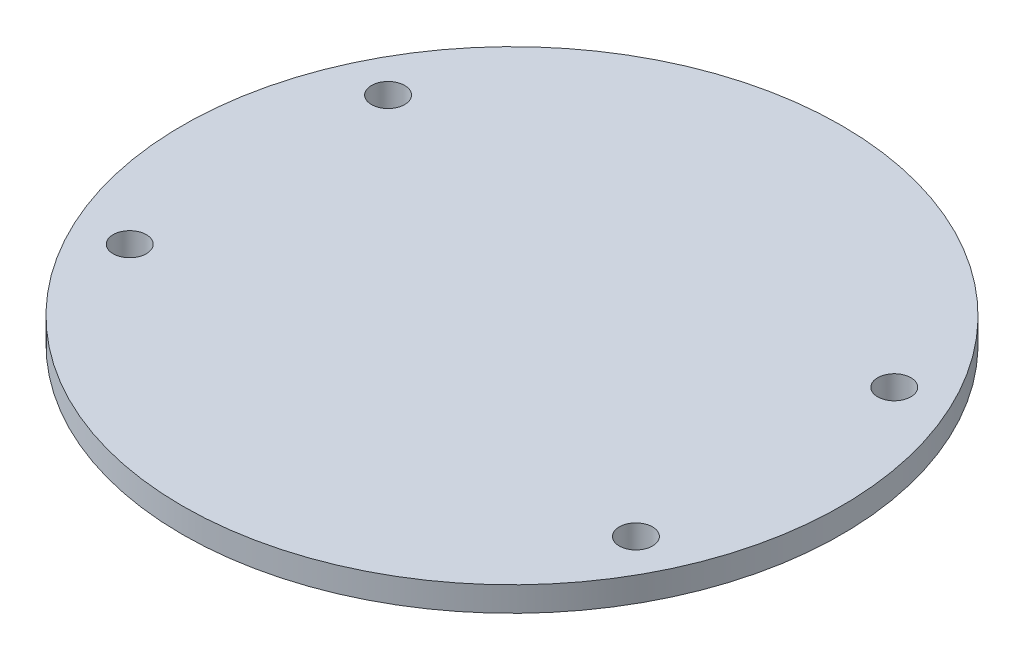
ISO-10303-21;
HEADER;
FILE_DESCRIPTION(('STEP AP214'),'2;1');
FILE_NAME('part.step','',(''),(''),'','','');
FILE_SCHEMA(('AUTOMOTIVE_DESIGN { 1 0 10303 214 1 1 1 1 }'));
ENDSEC;
DATA;
#1=APPLICATION_CONTEXT('core data for automotive mechanical design processes');
#2=APPLICATION_PROTOCOL_DEFINITION('international standard','automotive_design',2000,#1);
#3=PRODUCT_CONTEXT('',#1,'mechanical');
#4=PRODUCT('Part','Part','',(#3));
#5=PRODUCT_RELATED_PRODUCT_CATEGORY('part','',(#4));
#6=PRODUCT_DEFINITION_FORMATION('','',#4);
#7=PRODUCT_DEFINITION_CONTEXT('part definition',#1,'design');
#8=PRODUCT_DEFINITION('design','',#6,#7);
#9=PRODUCT_DEFINITION_SHAPE('','',#8);
#10=(LENGTH_UNIT() NAMED_UNIT(*) SI_UNIT(.MILLI.,.METRE.));
#11=(NAMED_UNIT(*) PLANE_ANGLE_UNIT() SI_UNIT($,.RADIAN.));
#12=(NAMED_UNIT(*) SI_UNIT($,.STERADIAN.) SOLID_ANGLE_UNIT());
#13=UNCERTAINTY_MEASURE_WITH_UNIT(LENGTH_MEASURE(1.E-05),#10,'distance_accuracy_value','');
#14=(GEOMETRIC_REPRESENTATION_CONTEXT(3) GLOBAL_UNCERTAINTY_ASSIGNED_CONTEXT((#13)) GLOBAL_UNIT_ASSIGNED_CONTEXT((#10,
#11,#12)) REPRESENTATION_CONTEXT('',''));
#15=CARTESIAN_POINT('',(0.,0.,0.));
#16=DIRECTION('',(0.,0.,1.));
#17=DIRECTION('',(1.,0.,0.));
#18=AXIS2_PLACEMENT_3D('',#15,#16,#17);
#19=CARTESIAN_POINT('',(-24.384,2.38125,12.446));
#20=DIRECTION('',(0.,-1.,0.));
#21=DIRECTION('',(0.,0.,-1.));
#22=AXIS2_PLACEMENT_3D('',#19,#20,#21);
#23=CYLINDRICAL_SURFACE('',#22,1.6);
#24=CARTESIAN_POINT('',(-24.384,2.38125,12.446));
#25=DIRECTION('',(0.,1.,0.));
#26=DIRECTION('',(0.,0.,1.));
#27=AXIS2_PLACEMENT_3D('',#24,#25,#26);
#28=CIRCLE('',#27,1.6);
#29=CARTESIAN_POINT('',(-24.384,2.38125,10.846));
#30=VERTEX_POINT('',#29);
#31=EDGE_CURVE('E43',#30,#30,#28,.T.);
#32=CARTESIAN_POINT('',(-24.384,0.,12.446));
#33=DIRECTION('',(0.,1.,0.));
#34=DIRECTION('',(0.,0.,1.));
#35=AXIS2_PLACEMENT_3D('',#32,#33,#34);
#36=CIRCLE('',#35,1.6);
#37=CARTESIAN_POINT('',(-24.384,0.,10.846));
#38=VERTEX_POINT('',#37);
#39=EDGE_CURVE('E62',#38,#38,#36,.T.);
#40=CARTESIAN_POINT('',(-24.384,2.38125,10.846));
#41=CARTESIAN_POINT('',(-24.384,2.3564453125,10.846));
#42=CARTESIAN_POINT('',(-24.384,2.331640625,10.846));
#43=CARTESIAN_POINT('',(-24.384,2.28203125,10.846));
#44=CARTESIAN_POINT('',(-24.384,2.2572265625,10.846));
#45=CARTESIAN_POINT('',(-24.384,2.2076171875,10.846));
#46=CARTESIAN_POINT('',(-24.384,2.1828125,10.846));
#47=CARTESIAN_POINT('',(-24.384,2.133203125,10.846));
#48=CARTESIAN_POINT('',(-24.384,2.1083984375,10.846));
#49=CARTESIAN_POINT('',(-24.384,2.0587890625,10.846));
#50=CARTESIAN_POINT('',(-24.384,2.033984375,10.846));
#51=CARTESIAN_POINT('',(-24.384,1.984375,10.846));
#52=CARTESIAN_POINT('',(-24.384,1.9595703125,10.846));
#53=CARTESIAN_POINT('',(-24.384,1.9099609375,10.846));
#54=CARTESIAN_POINT('',(-24.384,1.88515625,10.846));
#55=CARTESIAN_POINT('',(-24.384,1.835546875,10.846));
#56=CARTESIAN_POINT('',(-24.384,1.8107421875,10.846));
#57=CARTESIAN_POINT('',(-24.384,1.7611328125,10.846));
#58=CARTESIAN_POINT('',(-24.384,1.736328125,10.846));
#59=CARTESIAN_POINT('',(-24.384,1.68671875,10.846));
#60=CARTESIAN_POINT('',(-24.384,1.6619140625,10.846));
#61=CARTESIAN_POINT('',(-24.384,1.6123046875,10.846));
#62=CARTESIAN_POINT('',(-24.384,1.5875,10.846));
#63=CARTESIAN_POINT('',(-24.384,1.537890625,10.846));
#64=CARTESIAN_POINT('',(-24.384,1.5130859375,10.846));
#65=CARTESIAN_POINT('',(-24.384,1.4634765625,10.846));
#66=CARTESIAN_POINT('',(-24.384,1.438671875,10.846));
#67=CARTESIAN_POINT('',(-24.384,1.3890625,10.846));
#68=CARTESIAN_POINT('',(-24.384,1.3642578125,10.846));
#69=CARTESIAN_POINT('',(-24.384,1.3146484375,10.846));
#70=CARTESIAN_POINT('',(-24.384,1.28984375,10.846));
#71=CARTESIAN_POINT('',(-24.384,1.240234375,10.846));
#72=CARTESIAN_POINT('',(-24.384,1.2154296875,10.846));
#73=CARTESIAN_POINT('',(-24.384,1.1658203125,10.846));
#74=CARTESIAN_POINT('',(-24.384,1.141015625,10.846));
#75=CARTESIAN_POINT('',(-24.384,1.09140625,10.846));
#76=CARTESIAN_POINT('',(-24.384,1.0666015625,10.846));
#77=CARTESIAN_POINT('',(-24.384,1.0169921875,10.846));
#78=CARTESIAN_POINT('',(-24.384,0.9921875,10.846));
#79=CARTESIAN_POINT('',(-24.384,0.942578125,10.846));
#80=CARTESIAN_POINT('',(-24.384,0.9177734375,10.846));
#81=CARTESIAN_POINT('',(-24.384,0.8681640625,10.846));
#82=CARTESIAN_POINT('',(-24.384,0.843359375,10.846));
#83=CARTESIAN_POINT('',(-24.384,0.79375,10.846));
#84=CARTESIAN_POINT('',(-24.384,0.7689453125,10.846));
#85=CARTESIAN_POINT('',(-24.384,0.7193359375,10.846));
#86=CARTESIAN_POINT('',(-24.384,0.69453125,10.846));
#87=CARTESIAN_POINT('',(-24.384,0.644921875,10.846));
#88=CARTESIAN_POINT('',(-24.384,0.6201171875,10.846));
#89=CARTESIAN_POINT('',(-24.384,0.5705078125,10.846));
#90=CARTESIAN_POINT('',(-24.384,0.545703125,10.846));
#91=CARTESIAN_POINT('',(-24.384,0.49609375,10.846));
#92=CARTESIAN_POINT('',(-24.384,0.4712890625,10.846));
#93=CARTESIAN_POINT('',(-24.384,0.4216796875,10.846));
#94=CARTESIAN_POINT('',(-24.384,0.396875,10.846));
#95=CARTESIAN_POINT('',(-24.384,0.347265625,10.846));
#96=CARTESIAN_POINT('',(-24.384,0.3224609375,10.846));
#97=CARTESIAN_POINT('',(-24.384,0.2728515625,10.846));
#98=CARTESIAN_POINT('',(-24.384,0.248046875,10.846));
#99=CARTESIAN_POINT('',(-24.384,0.1984375,10.846));
#100=CARTESIAN_POINT('',(-24.384,0.1736328125,10.846));
#101=CARTESIAN_POINT('',(-24.384,0.1240234375,10.846));
#102=CARTESIAN_POINT('',(-24.384,0.0992187500000001,10.846));
#103=CARTESIAN_POINT('',(-24.384,0.049609375,10.846));
#104=CARTESIAN_POINT('',(-24.384,0.0248046875,10.846));
#105=CARTESIAN_POINT('',(-24.384,0.,10.846));
#106=B_SPLINE_CURVE_WITH_KNOTS('',3,(#40,#41,#42,#43,#44,#45,#46,#47,#48,#49,#50,#51,#52,#53,
#54,#55,#56,#57,#58,#59,#60,#61,#62,#63,#64,#65,#66,#67,#68,#69,#70,#71,#72,#73,#74,#75,#76,#77,
#78,#79,#80,#81,#82,#83,#84,#85,#86,#87,#88,#89,#90,#91,#92,#93,#94,#95,#96,#97,#98,#99,#100,
#101,#102,#103,#104,#105),.UNSPECIFIED.,.F.,.F.,(4,2,2,2,2,2,2,2,2,2,2,2,2,2,2,2,2,2,2,2,2,2,2,
2,2,2,2,2,2,2,2,2,4),(0.,0.0744140624999996,0.148828125,0.2232421875,0.29765625,0.3720703125,
0.446484375,0.5208984375,0.5953125,0.6697265625,0.744140625,0.8185546875,0.89296875,
0.9673828125,1.041796875,1.1162109375,1.190625,1.2650390625,1.339453125,1.4138671875,1.48828125,
1.5626953125,1.637109375,1.7115234375,1.7859375,1.8603515625,1.934765625,2.0091796875,
2.08359375,2.1580078125,2.232421875,2.3068359375,2.38125),.UNSPECIFIED.);
#107=EDGE_CURVE('BSEAM34',#30,#38,#106,.T.);
#108=ORIENTED_EDGE('',*,*,#31,.T.);
#109=ORIENTED_EDGE('',*,*,#39,.F.);
#110=ORIENTED_EDGE('',*,*,#107,.T.);
#111=ORIENTED_EDGE('',*,*,#107,.F.);
#112=EDGE_LOOP('',(#108,#110,#109,#111));
#113=FACE_BOUND('',#112,.T.);
#114=ADVANCED_FACE('F34',(#113),#23,.F.);
#115=CARTESIAN_POINT('',(-24.384,2.38125,-12.446));
#116=DIRECTION('',(0.,-1.,0.));
#117=DIRECTION('',(0.,0.,-1.));
#118=AXIS2_PLACEMENT_3D('',#115,#116,#117);
#119=CYLINDRICAL_SURFACE('',#118,1.6);
#120=CARTESIAN_POINT('',(-24.384,2.38125,-12.446));
#121=DIRECTION('',(0.,1.,0.));
#122=DIRECTION('',(0.,0.,1.));
#123=AXIS2_PLACEMENT_3D('',#120,#121,#122);
#124=CIRCLE('',#123,1.6);
#125=CARTESIAN_POINT('',(-24.384,2.38125,-14.046));
#126=VERTEX_POINT('',#125);
#127=EDGE_CURVE('E48',#126,#126,#124,.T.);
#128=CARTESIAN_POINT('',(-24.384,0.,-12.446));
#129=DIRECTION('',(0.,1.,0.));
#130=DIRECTION('',(0.,0.,1.));
#131=AXIS2_PLACEMENT_3D('',#128,#129,#130);
#132=CIRCLE('',#131,1.6);
#133=CARTESIAN_POINT('',(-24.384,0.,-14.046));
#134=VERTEX_POINT('',#133);
#135=EDGE_CURVE('E60',#134,#134,#132,.T.);
#136=CARTESIAN_POINT('',(-24.384,2.38125,-14.046));
#137=CARTESIAN_POINT('',(-24.384,2.3564453125,-14.046));
#138=CARTESIAN_POINT('',(-24.384,2.331640625,-14.046));
#139=CARTESIAN_POINT('',(-24.384,2.28203125,-14.046));
#140=CARTESIAN_POINT('',(-24.384,2.2572265625,-14.046));
#141=CARTESIAN_POINT('',(-24.384,2.2076171875,-14.046));
#142=CARTESIAN_POINT('',(-24.384,2.1828125,-14.046));
#143=CARTESIAN_POINT('',(-24.384,2.133203125,-14.046));
#144=CARTESIAN_POINT('',(-24.384,2.1083984375,-14.046));
#145=CARTESIAN_POINT('',(-24.384,2.0587890625,-14.046));
#146=CARTESIAN_POINT('',(-24.384,2.033984375,-14.046));
#147=CARTESIAN_POINT('',(-24.384,1.984375,-14.046));
#148=CARTESIAN_POINT('',(-24.384,1.9595703125,-14.046));
#149=CARTESIAN_POINT('',(-24.384,1.9099609375,-14.046));
#150=CARTESIAN_POINT('',(-24.384,1.88515625,-14.046));
#151=CARTESIAN_POINT('',(-24.384,1.835546875,-14.046));
#152=CARTESIAN_POINT('',(-24.384,1.8107421875,-14.046));
#153=CARTESIAN_POINT('',(-24.384,1.7611328125,-14.046));
#154=CARTESIAN_POINT('',(-24.384,1.736328125,-14.046));
#155=CARTESIAN_POINT('',(-24.384,1.68671875,-14.046));
#156=CARTESIAN_POINT('',(-24.384,1.6619140625,-14.046));
#157=CARTESIAN_POINT('',(-24.384,1.6123046875,-14.046));
#158=CARTESIAN_POINT('',(-24.384,1.5875,-14.046));
#159=CARTESIAN_POINT('',(-24.384,1.537890625,-14.046));
#160=CARTESIAN_POINT('',(-24.384,1.5130859375,-14.046));
#161=CARTESIAN_POINT('',(-24.384,1.4634765625,-14.046));
#162=CARTESIAN_POINT('',(-24.384,1.438671875,-14.046));
#163=CARTESIAN_POINT('',(-24.384,1.3890625,-14.046));
#164=CARTESIAN_POINT('',(-24.384,1.3642578125,-14.046));
#165=CARTESIAN_POINT('',(-24.384,1.3146484375,-14.046));
#166=CARTESIAN_POINT('',(-24.384,1.28984375,-14.046));
#167=CARTESIAN_POINT('',(-24.384,1.240234375,-14.046));
#168=CARTESIAN_POINT('',(-24.384,1.2154296875,-14.046));
#169=CARTESIAN_POINT('',(-24.384,1.1658203125,-14.046));
#170=CARTESIAN_POINT('',(-24.384,1.141015625,-14.046));
#171=CARTESIAN_POINT('',(-24.384,1.09140625,-14.046));
#172=CARTESIAN_POINT('',(-24.384,1.0666015625,-14.046));
#173=CARTESIAN_POINT('',(-24.384,1.0169921875,-14.046));
#174=CARTESIAN_POINT('',(-24.384,0.9921875,-14.046));
#175=CARTESIAN_POINT('',(-24.384,0.942578125,-14.046));
#176=CARTESIAN_POINT('',(-24.384,0.9177734375,-14.046));
#177=CARTESIAN_POINT('',(-24.384,0.8681640625,-14.046));
#178=CARTESIAN_POINT('',(-24.384,0.843359375,-14.046));
#179=CARTESIAN_POINT('',(-24.384,0.79375,-14.046));
#180=CARTESIAN_POINT('',(-24.384,0.7689453125,-14.046));
#181=CARTESIAN_POINT('',(-24.384,0.7193359375,-14.046));
#182=CARTESIAN_POINT('',(-24.384,0.69453125,-14.046));
#183=CARTESIAN_POINT('',(-24.384,0.644921875,-14.046));
#184=CARTESIAN_POINT('',(-24.384,0.6201171875,-14.046));
#185=CARTESIAN_POINT('',(-24.384,0.5705078125,-14.046));
#186=CARTESIAN_POINT('',(-24.384,0.545703125,-14.046));
#187=CARTESIAN_POINT('',(-24.384,0.49609375,-14.046));
#188=CARTESIAN_POINT('',(-24.384,0.4712890625,-14.046));
#189=CARTESIAN_POINT('',(-24.384,0.4216796875,-14.046));
#190=CARTESIAN_POINT('',(-24.384,0.396875,-14.046));
#191=CARTESIAN_POINT('',(-24.384,0.347265625,-14.046));
#192=CARTESIAN_POINT('',(-24.384,0.3224609375,-14.046));
#193=CARTESIAN_POINT('',(-24.384,0.2728515625,-14.046));
#194=CARTESIAN_POINT('',(-24.384,0.248046875,-14.046));
#195=CARTESIAN_POINT('',(-24.384,0.1984375,-14.046));
#196=CARTESIAN_POINT('',(-24.384,0.1736328125,-14.046));
#197=CARTESIAN_POINT('',(-24.384,0.1240234375,-14.046));
#198=CARTESIAN_POINT('',(-24.384,0.0992187500000001,-14.046));
#199=CARTESIAN_POINT('',(-24.384,0.049609375,-14.046));
#200=CARTESIAN_POINT('',(-24.384,0.0248046875,-14.046));
#201=CARTESIAN_POINT('',(-24.384,0.,-14.046));
#202=B_SPLINE_CURVE_WITH_KNOTS('',3,(#136,#137,#138,#139,#140,#141,#142,#143,#144,#145,#146,
#147,#148,#149,#150,#151,#152,#153,#154,#155,#156,#157,#158,#159,#160,#161,#162,#163,#164,#165,
#166,#167,#168,#169,#170,#171,#172,#173,#174,#175,#176,#177,#178,#179,#180,#181,#182,#183,#184,
#185,#186,#187,#188,#189,#190,#191,#192,#193,#194,#195,#196,#197,#198,#199,#200,#201),
.UNSPECIFIED.,.F.,.F.,(4,2,2,2,2,2,2,2,2,2,2,2,2,2,2,2,2,2,2,2,2,2,2,2,2,2,2,2,2,2,2,2,4),(0.,
0.0744140624999996,0.148828125,0.2232421875,0.29765625,0.3720703125,0.446484375,0.5208984375,
0.5953125,0.6697265625,0.744140625,0.8185546875,0.89296875,0.9673828125,1.041796875,
1.1162109375,1.190625,1.2650390625,1.339453125,1.4138671875,1.48828125,1.5626953125,1.637109375,
1.7115234375,1.7859375,1.8603515625,1.934765625,2.0091796875,2.08359375,2.1580078125,
2.232421875,2.3068359375,2.38125),.UNSPECIFIED.);
#203=EDGE_CURVE('BSEAM89',#126,#134,#202,.T.);
#204=ORIENTED_EDGE('',*,*,#127,.T.);
#205=ORIENTED_EDGE('',*,*,#135,.F.);
#206=ORIENTED_EDGE('',*,*,#203,.T.);
#207=ORIENTED_EDGE('',*,*,#203,.F.);
#208=EDGE_LOOP('',(#204,#206,#205,#207));
#209=FACE_BOUND('',#208,.T.);
#210=ADVANCED_FACE('F89',(#209),#119,.F.);
#211=CARTESIAN_POINT('',(24.384,2.38125,12.446));
#212=DIRECTION('',(0.,-1.,0.));
#213=DIRECTION('',(0.,0.,-1.));
#214=AXIS2_PLACEMENT_3D('',#211,#212,#213);
#215=CYLINDRICAL_SURFACE('',#214,1.6);
#216=CARTESIAN_POINT('',(24.384,2.38125,12.446));
#217=DIRECTION('',(0.,1.,0.));
#218=DIRECTION('',(0.,0.,1.));
#219=AXIS2_PLACEMENT_3D('',#216,#217,#218);
#220=CIRCLE('',#219,1.6);
#221=CARTESIAN_POINT('',(24.384,2.38125,10.846));
#222=VERTEX_POINT('',#221);
#223=EDGE_CURVE('E72',#222,#222,#220,.T.);
#224=CARTESIAN_POINT('',(24.384,0.,12.446));
#225=DIRECTION('',(0.,1.,0.));
#226=DIRECTION('',(0.,0.,1.));
#227=AXIS2_PLACEMENT_3D('',#224,#225,#226);
#228=CIRCLE('',#227,1.6);
#229=CARTESIAN_POINT('',(24.384,0.,10.846));
#230=VERTEX_POINT('',#229);
#231=EDGE_CURVE('E57',#230,#230,#228,.T.);
#232=CARTESIAN_POINT('',(24.384,2.38125,10.846));
#233=CARTESIAN_POINT('',(24.384,2.3564453125,10.846));
#234=CARTESIAN_POINT('',(24.384,2.331640625,10.846));
#235=CARTESIAN_POINT('',(24.384,2.28203125,10.846));
#236=CARTESIAN_POINT('',(24.384,2.2572265625,10.846));
#237=CARTESIAN_POINT('',(24.384,2.2076171875,10.846));
#238=CARTESIAN_POINT('',(24.384,2.1828125,10.846));
#239=CARTESIAN_POINT('',(24.384,2.133203125,10.846));
#240=CARTESIAN_POINT('',(24.384,2.1083984375,10.846));
#241=CARTESIAN_POINT('',(24.384,2.0587890625,10.846));
#242=CARTESIAN_POINT('',(24.384,2.033984375,10.846));
#243=CARTESIAN_POINT('',(24.384,1.984375,10.846));
#244=CARTESIAN_POINT('',(24.384,1.9595703125,10.846));
#245=CARTESIAN_POINT('',(24.384,1.9099609375,10.846));
#246=CARTESIAN_POINT('',(24.384,1.88515625,10.846));
#247=CARTESIAN_POINT('',(24.384,1.835546875,10.846));
#248=CARTESIAN_POINT('',(24.384,1.8107421875,10.846));
#249=CARTESIAN_POINT('',(24.384,1.7611328125,10.846));
#250=CARTESIAN_POINT('',(24.384,1.736328125,10.846));
#251=CARTESIAN_POINT('',(24.384,1.68671875,10.846));
#252=CARTESIAN_POINT('',(24.384,1.6619140625,10.846));
#253=CARTESIAN_POINT('',(24.384,1.6123046875,10.846));
#254=CARTESIAN_POINT('',(24.384,1.5875,10.846));
#255=CARTESIAN_POINT('',(24.384,1.537890625,10.846));
#256=CARTESIAN_POINT('',(24.384,1.5130859375,10.846));
#257=CARTESIAN_POINT('',(24.384,1.4634765625,10.846));
#258=CARTESIAN_POINT('',(24.384,1.438671875,10.846));
#259=CARTESIAN_POINT('',(24.384,1.3890625,10.846));
#260=CARTESIAN_POINT('',(24.384,1.3642578125,10.846));
#261=CARTESIAN_POINT('',(24.384,1.3146484375,10.846));
#262=CARTESIAN_POINT('',(24.384,1.28984375,10.846));
#263=CARTESIAN_POINT('',(24.384,1.240234375,10.846));
#264=CARTESIAN_POINT('',(24.384,1.2154296875,10.846));
#265=CARTESIAN_POINT('',(24.384,1.1658203125,10.846));
#266=CARTESIAN_POINT('',(24.384,1.141015625,10.846));
#267=CARTESIAN_POINT('',(24.384,1.09140625,10.846));
#268=CARTESIAN_POINT('',(24.384,1.0666015625,10.846));
#269=CARTESIAN_POINT('',(24.384,1.0169921875,10.846));
#270=CARTESIAN_POINT('',(24.384,0.9921875,10.846));
#271=CARTESIAN_POINT('',(24.384,0.942578125,10.846));
#272=CARTESIAN_POINT('',(24.384,0.9177734375,10.846));
#273=CARTESIAN_POINT('',(24.384,0.8681640625,10.846));
#274=CARTESIAN_POINT('',(24.384,0.843359375,10.846));
#275=CARTESIAN_POINT('',(24.384,0.79375,10.846));
#276=CARTESIAN_POINT('',(24.384,0.7689453125,10.846));
#277=CARTESIAN_POINT('',(24.384,0.7193359375,10.846));
#278=CARTESIAN_POINT('',(24.384,0.69453125,10.846));
#279=CARTESIAN_POINT('',(24.384,0.644921875,10.846));
#280=CARTESIAN_POINT('',(24.384,0.6201171875,10.846));
#281=CARTESIAN_POINT('',(24.384,0.5705078125,10.846));
#282=CARTESIAN_POINT('',(24.384,0.545703125,10.846));
#283=CARTESIAN_POINT('',(24.384,0.49609375,10.846));
#284=CARTESIAN_POINT('',(24.384,0.4712890625,10.846));
#285=CARTESIAN_POINT('',(24.384,0.4216796875,10.846));
#286=CARTESIAN_POINT('',(24.384,0.396875,10.846));
#287=CARTESIAN_POINT('',(24.384,0.347265625,10.846));
#288=CARTESIAN_POINT('',(24.384,0.3224609375,10.846));
#289=CARTESIAN_POINT('',(24.384,0.2728515625,10.846));
#290=CARTESIAN_POINT('',(24.384,0.248046875,10.846));
#291=CARTESIAN_POINT('',(24.384,0.1984375,10.846));
#292=CARTESIAN_POINT('',(24.384,0.1736328125,10.846));
#293=CARTESIAN_POINT('',(24.384,0.1240234375,10.846));
#294=CARTESIAN_POINT('',(24.384,0.0992187500000001,10.846));
#295=CARTESIAN_POINT('',(24.384,0.049609375,10.846));
#296=CARTESIAN_POINT('',(24.384,0.0248046875,10.846));
#297=CARTESIAN_POINT('',(24.384,0.,10.846));
#298=B_SPLINE_CURVE_WITH_KNOTS('',3,(#232,#233,#234,#235,#236,#237,#238,#239,#240,#241,#242,
#243,#244,#245,#246,#247,#248,#249,#250,#251,#252,#253,#254,#255,#256,#257,#258,#259,#260,#261,
#262,#263,#264,#265,#266,#267,#268,#269,#270,#271,#272,#273,#274,#275,#276,#277,#278,#279,#280,
#281,#282,#283,#284,#285,#286,#287,#288,#289,#290,#291,#292,#293,#294,#295,#296,#297),
.UNSPECIFIED.,.F.,.F.,(4,2,2,2,2,2,2,2,2,2,2,2,2,2,2,2,2,2,2,2,2,2,2,2,2,2,2,2,2,2,2,2,4),(0.,
0.0744140624999996,0.148828125,0.2232421875,0.29765625,0.3720703125,0.446484375,0.5208984375,
0.5953125,0.6697265625,0.744140625,0.8185546875,0.89296875,0.9673828125,1.041796875,
1.1162109375,1.190625,1.2650390625,1.339453125,1.4138671875,1.48828125,1.5626953125,1.637109375,
1.7115234375,1.7859375,1.8603515625,1.934765625,2.0091796875,2.08359375,2.1580078125,
2.232421875,2.3068359375,2.38125),.UNSPECIFIED.);
#299=EDGE_CURVE('BSEAM107',#222,#230,#298,.T.);
#300=ORIENTED_EDGE('',*,*,#223,.T.);
#301=ORIENTED_EDGE('',*,*,#231,.F.);
#302=ORIENTED_EDGE('',*,*,#299,.T.);
#303=ORIENTED_EDGE('',*,*,#299,.F.);
#304=EDGE_LOOP('',(#300,#302,#301,#303));
#305=FACE_BOUND('',#304,.T.);
#306=ADVANCED_FACE('F107',(#305),#215,.F.);
#307=CARTESIAN_POINT('',(24.384,2.38125,-12.446));
#308=DIRECTION('',(0.,-1.,0.));
#309=DIRECTION('',(0.,0.,-1.));
#310=AXIS2_PLACEMENT_3D('',#307,#308,#309);
#311=CYLINDRICAL_SURFACE('',#310,1.6);
#312=CARTESIAN_POINT('',(24.384,2.38125,-12.446));
#313=DIRECTION('',(0.,1.,0.));
#314=DIRECTION('',(0.,0.,1.));
#315=AXIS2_PLACEMENT_3D('',#312,#313,#314);
#316=CIRCLE('',#315,1.6);
#317=CARTESIAN_POINT('',(24.384,2.38125,-14.046));
#318=VERTEX_POINT('',#317);
#319=EDGE_CURVE('E67',#318,#318,#316,.T.);
#320=CARTESIAN_POINT('',(24.384,0.,-12.446));
#321=DIRECTION('',(0.,1.,0.));
#322=DIRECTION('',(0.,0.,1.));
#323=AXIS2_PLACEMENT_3D('',#320,#321,#322);
#324=CIRCLE('',#323,1.6);
#325=CARTESIAN_POINT('',(24.384,0.,-14.046));
#326=VERTEX_POINT('',#325);
#327=EDGE_CURVE('E54',#326,#326,#324,.T.);
#328=CARTESIAN_POINT('',(24.384,2.38125,-14.046));
#329=CARTESIAN_POINT('',(24.384,2.3564453125,-14.046));
#330=CARTESIAN_POINT('',(24.384,2.331640625,-14.046));
#331=CARTESIAN_POINT('',(24.384,2.28203125,-14.046));
#332=CARTESIAN_POINT('',(24.384,2.2572265625,-14.046));
#333=CARTESIAN_POINT('',(24.384,2.2076171875,-14.046));
#334=CARTESIAN_POINT('',(24.384,2.1828125,-14.046));
#335=CARTESIAN_POINT('',(24.384,2.133203125,-14.046));
#336=CARTESIAN_POINT('',(24.384,2.1083984375,-14.046));
#337=CARTESIAN_POINT('',(24.384,2.0587890625,-14.046));
#338=CARTESIAN_POINT('',(24.384,2.033984375,-14.046));
#339=CARTESIAN_POINT('',(24.384,1.984375,-14.046));
#340=CARTESIAN_POINT('',(24.384,1.9595703125,-14.046));
#341=CARTESIAN_POINT('',(24.384,1.9099609375,-14.046));
#342=CARTESIAN_POINT('',(24.384,1.88515625,-14.046));
#343=CARTESIAN_POINT('',(24.384,1.835546875,-14.046));
#344=CARTESIAN_POINT('',(24.384,1.8107421875,-14.046));
#345=CARTESIAN_POINT('',(24.384,1.7611328125,-14.046));
#346=CARTESIAN_POINT('',(24.384,1.736328125,-14.046));
#347=CARTESIAN_POINT('',(24.384,1.68671875,-14.046));
#348=CARTESIAN_POINT('',(24.384,1.6619140625,-14.046));
#349=CARTESIAN_POINT('',(24.384,1.6123046875,-14.046));
#350=CARTESIAN_POINT('',(24.384,1.5875,-14.046));
#351=CARTESIAN_POINT('',(24.384,1.537890625,-14.046));
#352=CARTESIAN_POINT('',(24.384,1.5130859375,-14.046));
#353=CARTESIAN_POINT('',(24.384,1.4634765625,-14.046));
#354=CARTESIAN_POINT('',(24.384,1.438671875,-14.046));
#355=CARTESIAN_POINT('',(24.384,1.3890625,-14.046));
#356=CARTESIAN_POINT('',(24.384,1.3642578125,-14.046));
#357=CARTESIAN_POINT('',(24.384,1.3146484375,-14.046));
#358=CARTESIAN_POINT('',(24.384,1.28984375,-14.046));
#359=CARTESIAN_POINT('',(24.384,1.240234375,-14.046));
#360=CARTESIAN_POINT('',(24.384,1.2154296875,-14.046));
#361=CARTESIAN_POINT('',(24.384,1.1658203125,-14.046));
#362=CARTESIAN_POINT('',(24.384,1.141015625,-14.046));
#363=CARTESIAN_POINT('',(24.384,1.09140625,-14.046));
#364=CARTESIAN_POINT('',(24.384,1.0666015625,-14.046));
#365=CARTESIAN_POINT('',(24.384,1.0169921875,-14.046));
#366=CARTESIAN_POINT('',(24.384,0.9921875,-14.046));
#367=CARTESIAN_POINT('',(24.384,0.942578125,-14.046));
#368=CARTESIAN_POINT('',(24.384,0.9177734375,-14.046));
#369=CARTESIAN_POINT('',(24.384,0.8681640625,-14.046));
#370=CARTESIAN_POINT('',(24.384,0.843359375,-14.046));
#371=CARTESIAN_POINT('',(24.384,0.79375,-14.046));
#372=CARTESIAN_POINT('',(24.384,0.7689453125,-14.046));
#373=CARTESIAN_POINT('',(24.384,0.7193359375,-14.046));
#374=CARTESIAN_POINT('',(24.384,0.69453125,-14.046));
#375=CARTESIAN_POINT('',(24.384,0.644921875,-14.046));
#376=CARTESIAN_POINT('',(24.384,0.6201171875,-14.046));
#377=CARTESIAN_POINT('',(24.384,0.5705078125,-14.046));
#378=CARTESIAN_POINT('',(24.384,0.545703125,-14.046));
#379=CARTESIAN_POINT('',(24.384,0.49609375,-14.046));
#380=CARTESIAN_POINT('',(24.384,0.4712890625,-14.046));
#381=CARTESIAN_POINT('',(24.384,0.4216796875,-14.046));
#382=CARTESIAN_POINT('',(24.384,0.396875,-14.046));
#383=CARTESIAN_POINT('',(24.384,0.347265625,-14.046));
#384=CARTESIAN_POINT('',(24.384,0.3224609375,-14.046));
#385=CARTESIAN_POINT('',(24.384,0.2728515625,-14.046));
#386=CARTESIAN_POINT('',(24.384,0.248046875,-14.046));
#387=CARTESIAN_POINT('',(24.384,0.1984375,-14.046));
#388=CARTESIAN_POINT('',(24.384,0.1736328125,-14.046));
#389=CARTESIAN_POINT('',(24.384,0.1240234375,-14.046));
#390=CARTESIAN_POINT('',(24.384,0.0992187500000001,-14.046));
#391=CARTESIAN_POINT('',(24.384,0.049609375,-14.046));
#392=CARTESIAN_POINT('',(24.384,0.0248046875,-14.046));
#393=CARTESIAN_POINT('',(24.384,0.,-14.046));
#394=B_SPLINE_CURVE_WITH_KNOTS('',3,(#328,#329,#330,#331,#332,#333,#334,#335,#336,#337,#338,
#339,#340,#341,#342,#343,#344,#345,#346,#347,#348,#349,#350,#351,#352,#353,#354,#355,#356,#357,
#358,#359,#360,#361,#362,#363,#364,#365,#366,#367,#368,#369,#370,#371,#372,#373,#374,#375,#376,
#377,#378,#379,#380,#381,#382,#383,#384,#385,#386,#387,#388,#389,#390,#391,#392,#393),
.UNSPECIFIED.,.F.,.F.,(4,2,2,2,2,2,2,2,2,2,2,2,2,2,2,2,2,2,2,2,2,2,2,2,2,2,2,2,2,2,2,2,4),(0.,
0.0744140624999996,0.148828125,0.2232421875,0.29765625,0.3720703125,0.446484375,0.5208984375,
0.5953125,0.6697265625,0.744140625,0.8185546875,0.89296875,0.9673828125,1.041796875,
1.1162109375,1.190625,1.2650390625,1.339453125,1.4138671875,1.48828125,1.5626953125,1.637109375,
1.7115234375,1.7859375,1.8603515625,1.934765625,2.0091796875,2.08359375,2.1580078125,
2.232421875,2.3068359375,2.38125),.UNSPECIFIED.);
#395=EDGE_CURVE('BSEAM36',#318,#326,#394,.T.);
#396=ORIENTED_EDGE('',*,*,#319,.T.);
#397=ORIENTED_EDGE('',*,*,#327,.F.);
#398=ORIENTED_EDGE('',*,*,#395,.T.);
#399=ORIENTED_EDGE('',*,*,#395,.F.);
#400=EDGE_LOOP('',(#396,#398,#397,#399));
#401=FACE_BOUND('',#400,.T.);
#402=ADVANCED_FACE('F36',(#401),#311,.F.);
#403=CARTESIAN_POINT('',(0.,2.38125,0.));
#404=DIRECTION('',(0.,-1.,0.));
#405=DIRECTION('',(0.,0.,-1.));
#406=AXIS2_PLACEMENT_3D('',#403,#404,#405);
#407=CYLINDRICAL_SURFACE('',#406,31.75);
#408=CARTESIAN_POINT('',(0.,2.38125,0.));
#409=DIRECTION('',(0.,1.,0.));
#410=DIRECTION('',(0.,0.,1.));
#411=AXIS2_PLACEMENT_3D('',#408,#409,#410);
#412=CIRCLE('',#411,31.75);
#413=CARTESIAN_POINT('',(0.,2.38125,-31.75));
#414=VERTEX_POINT('',#413);
#415=EDGE_CURVE('E11',#414,#414,#412,.T.);
#416=CARTESIAN_POINT('',(0.,0.,0.));
#417=DIRECTION('',(0.,1.,0.));
#418=DIRECTION('',(0.,0.,1.));
#419=AXIS2_PLACEMENT_3D('',#416,#417,#418);
#420=CIRCLE('',#419,31.75);
#421=CARTESIAN_POINT('',(0.,0.,-31.75));
#422=VERTEX_POINT('',#421);
#423=EDGE_CURVE('E38',#422,#422,#420,.T.);
#424=CARTESIAN_POINT('',(0.,2.38125,-31.75));
#425=CARTESIAN_POINT('',(0.,2.3564453125,-31.75));
#426=CARTESIAN_POINT('',(0.,2.331640625,-31.75));
#427=CARTESIAN_POINT('',(0.,2.28203125,-31.75));
#428=CARTESIAN_POINT('',(0.,2.2572265625,-31.75));
#429=CARTESIAN_POINT('',(0.,2.2076171875,-31.75));
#430=CARTESIAN_POINT('',(0.,2.1828125,-31.75));
#431=CARTESIAN_POINT('',(0.,2.133203125,-31.75));
#432=CARTESIAN_POINT('',(0.,2.1083984375,-31.75));
#433=CARTESIAN_POINT('',(0.,2.0587890625,-31.75));
#434=CARTESIAN_POINT('',(0.,2.033984375,-31.75));
#435=CARTESIAN_POINT('',(0.,1.984375,-31.75));
#436=CARTESIAN_POINT('',(0.,1.9595703125,-31.75));
#437=CARTESIAN_POINT('',(0.,1.9099609375,-31.75));
#438=CARTESIAN_POINT('',(0.,1.88515625,-31.75));
#439=CARTESIAN_POINT('',(0.,1.835546875,-31.75));
#440=CARTESIAN_POINT('',(0.,1.8107421875,-31.75));
#441=CARTESIAN_POINT('',(0.,1.7611328125,-31.75));
#442=CARTESIAN_POINT('',(0.,1.736328125,-31.75));
#443=CARTESIAN_POINT('',(0.,1.68671875,-31.75));
#444=CARTESIAN_POINT('',(0.,1.6619140625,-31.75));
#445=CARTESIAN_POINT('',(0.,1.6123046875,-31.75));
#446=CARTESIAN_POINT('',(0.,1.5875,-31.75));
#447=CARTESIAN_POINT('',(0.,1.537890625,-31.75));
#448=CARTESIAN_POINT('',(0.,1.5130859375,-31.75));
#449=CARTESIAN_POINT('',(0.,1.4634765625,-31.75));
#450=CARTESIAN_POINT('',(0.,1.438671875,-31.75));
#451=CARTESIAN_POINT('',(0.,1.3890625,-31.75));
#452=CARTESIAN_POINT('',(0.,1.3642578125,-31.75));
#453=CARTESIAN_POINT('',(0.,1.3146484375,-31.75));
#454=CARTESIAN_POINT('',(0.,1.28984375,-31.75));
#455=CARTESIAN_POINT('',(0.,1.240234375,-31.75));
#456=CARTESIAN_POINT('',(0.,1.2154296875,-31.75));
#457=CARTESIAN_POINT('',(0.,1.1658203125,-31.75));
#458=CARTESIAN_POINT('',(0.,1.141015625,-31.75));
#459=CARTESIAN_POINT('',(0.,1.09140625,-31.75));
#460=CARTESIAN_POINT('',(0.,1.0666015625,-31.75));
#461=CARTESIAN_POINT('',(0.,1.0169921875,-31.75));
#462=CARTESIAN_POINT('',(0.,0.9921875,-31.75));
#463=CARTESIAN_POINT('',(0.,0.942578125,-31.75));
#464=CARTESIAN_POINT('',(0.,0.9177734375,-31.75));
#465=CARTESIAN_POINT('',(0.,0.8681640625,-31.75));
#466=CARTESIAN_POINT('',(0.,0.843359375,-31.75));
#467=CARTESIAN_POINT('',(0.,0.79375,-31.75));
#468=CARTESIAN_POINT('',(0.,0.7689453125,-31.75));
#469=CARTESIAN_POINT('',(0.,0.7193359375,-31.75));
#470=CARTESIAN_POINT('',(0.,0.69453125,-31.75));
#471=CARTESIAN_POINT('',(0.,0.644921875,-31.75));
#472=CARTESIAN_POINT('',(0.,0.6201171875,-31.75));
#473=CARTESIAN_POINT('',(0.,0.5705078125,-31.75));
#474=CARTESIAN_POINT('',(0.,0.545703125,-31.75));
#475=CARTESIAN_POINT('',(0.,0.49609375,-31.75));
#476=CARTESIAN_POINT('',(0.,0.4712890625,-31.75));
#477=CARTESIAN_POINT('',(0.,0.4216796875,-31.75));
#478=CARTESIAN_POINT('',(0.,0.396875,-31.75));
#479=CARTESIAN_POINT('',(0.,0.347265625,-31.75));
#480=CARTESIAN_POINT('',(0.,0.3224609375,-31.75));
#481=CARTESIAN_POINT('',(0.,0.2728515625,-31.75));
#482=CARTESIAN_POINT('',(0.,0.248046875,-31.75));
#483=CARTESIAN_POINT('',(0.,0.1984375,-31.75));
#484=CARTESIAN_POINT('',(0.,0.1736328125,-31.75));
#485=CARTESIAN_POINT('',(0.,0.1240234375,-31.75));
#486=CARTESIAN_POINT('',(0.,0.0992187500000001,-31.75));
#487=CARTESIAN_POINT('',(0.,0.049609375,-31.75));
#488=CARTESIAN_POINT('',(0.,0.0248046875,-31.75));
#489=CARTESIAN_POINT('',(0.,0.,-31.75));
#490=B_SPLINE_CURVE_WITH_KNOTS('',3,(#424,#425,#426,#427,#428,#429,#430,#431,#432,#433,#434,
#435,#436,#437,#438,#439,#440,#441,#442,#443,#444,#445,#446,#447,#448,#449,#450,#451,#452,#453,
#454,#455,#456,#457,#458,#459,#460,#461,#462,#463,#464,#465,#466,#467,#468,#469,#470,#471,#472,
#473,#474,#475,#476,#477,#478,#479,#480,#481,#482,#483,#484,#485,#486,#487,#488,#489),
.UNSPECIFIED.,.F.,.F.,(4,2,2,2,2,2,2,2,2,2,2,2,2,2,2,2,2,2,2,2,2,2,2,2,2,2,2,2,2,2,2,2,4),(0.,
0.0744140625,0.148828125,0.2232421875,0.29765625,0.3720703125,0.446484375,0.5208984375,
0.5953125,0.6697265625,0.744140625,0.8185546875,0.89296875,0.9673828125,1.041796875,
1.1162109375,1.190625,1.2650390625,1.339453125,1.4138671875,1.48828125,1.5626953125,1.637109375,
1.7115234375,1.7859375,1.8603515625,1.934765625,2.0091796875,2.08359375,2.1580078125,
2.232421875,2.3068359375,2.38125),.UNSPECIFIED.);
#491=EDGE_CURVE('BSEAM96',#414,#422,#490,.T.);
#492=ORIENTED_EDGE('',*,*,#415,.F.);
#493=ORIENTED_EDGE('',*,*,#423,.T.);
#494=ORIENTED_EDGE('',*,*,#491,.T.);
#495=ORIENTED_EDGE('',*,*,#491,.F.);
#496=EDGE_LOOP('',(#492,#494,#493,#495));
#497=FACE_BOUND('',#496,.T.);
#498=ADVANCED_FACE('F96',(#497),#407,.T.);
#499=CARTESIAN_POINT('',(0.,2.38125,0.));
#500=DIRECTION('',(0.,1.,0.));
#501=DIRECTION('',(0.,0.,1.));
#502=AXIS2_PLACEMENT_3D('',#499,#500,#501);
#503=PLANE('',#502);
#504=ORIENTED_EDGE('',*,*,#319,.F.);
#505=EDGE_LOOP('',(#504));
#506=FACE_BOUND('',#505,.T.);
#507=ORIENTED_EDGE('',*,*,#223,.F.);
#508=EDGE_LOOP('',(#507));
#509=FACE_BOUND('',#508,.T.);
#510=ORIENTED_EDGE('',*,*,#127,.F.);
#511=EDGE_LOOP('',(#510));
#512=FACE_BOUND('',#511,.T.);
#513=ORIENTED_EDGE('',*,*,#31,.F.);
#514=EDGE_LOOP('',(#513));
#515=FACE_BOUND('',#514,.T.);
#516=ORIENTED_EDGE('',*,*,#415,.T.);
#517=EDGE_LOOP('',(#516));
#518=FACE_BOUND('',#517,.T.);
#519=ADVANCED_FACE('F92',(#506,#509,#512,#515,#518),#503,.T.);
#520=CARTESIAN_POINT('',(0.,0.,0.));
#521=DIRECTION('',(0.,1.,0.));
#522=DIRECTION('',(0.,0.,1.));
#523=AXIS2_PLACEMENT_3D('',#520,#521,#522);
#524=PLANE('',#523);
#525=ORIENTED_EDGE('',*,*,#327,.T.);
#526=EDGE_LOOP('',(#525));
#527=FACE_BOUND('',#526,.T.);
#528=ORIENTED_EDGE('',*,*,#231,.T.);
#529=EDGE_LOOP('',(#528));
#530=FACE_BOUND('',#529,.T.);
#531=ORIENTED_EDGE('',*,*,#135,.T.);
#532=EDGE_LOOP('',(#531));
#533=FACE_BOUND('',#532,.T.);
#534=ORIENTED_EDGE('',*,*,#39,.T.);
#535=EDGE_LOOP('',(#534));
#536=FACE_BOUND('',#535,.T.);
#537=ORIENTED_EDGE('',*,*,#423,.F.);
#538=EDGE_LOOP('',(#537));
#539=FACE_BOUND('',#538,.T.);
#540=ADVANCED_FACE('F95',(#527,#530,#533,#536,#539),#524,.F.);
#541=CLOSED_SHELL('',(#114,#210,#306,#402,#498,#519,#540));
#542=MANIFOLD_SOLID_BREP('B2',#541);
#543=ADVANCED_BREP_SHAPE_REPRESENTATION('',(#18,#542),#14);
#544=SHAPE_DEFINITION_REPRESENTATION(#9,#543);
ENDSEC;
END-ISO-10303-21;
